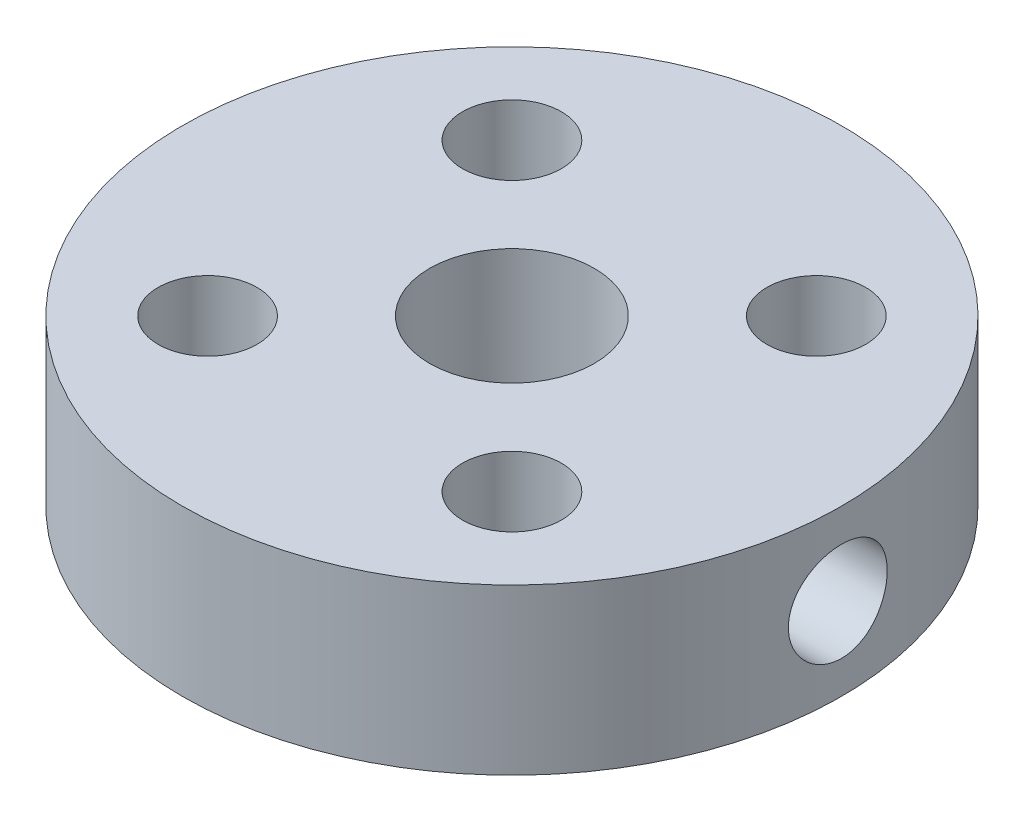
ISO-10303-21;
HEADER;
FILE_DESCRIPTION(('STEP AP214'),'2;1');
FILE_NAME('part.step','',(''),(''),'','','');
FILE_SCHEMA(('AUTOMOTIVE_DESIGN { 1 0 10303 214 1 1 1 1 }'));
ENDSEC;
DATA;
#1=APPLICATION_CONTEXT('core data for automotive mechanical design processes');
#2=APPLICATION_PROTOCOL_DEFINITION('international standard','automotive_design',2000,#1);
#3=PRODUCT_CONTEXT('',#1,'mechanical');
#4=PRODUCT('Part','Part','',(#3));
#5=PRODUCT_RELATED_PRODUCT_CATEGORY('part','',(#4));
#6=PRODUCT_DEFINITION_FORMATION('','',#4);
#7=PRODUCT_DEFINITION_CONTEXT('part definition',#1,'design');
#8=PRODUCT_DEFINITION('design','',#6,#7);
#9=PRODUCT_DEFINITION_SHAPE('','',#8);
#10=(LENGTH_UNIT() NAMED_UNIT(*) SI_UNIT(.MILLI.,.METRE.));
#11=(NAMED_UNIT(*) PLANE_ANGLE_UNIT() SI_UNIT($,.RADIAN.));
#12=(NAMED_UNIT(*) SI_UNIT($,.STERADIAN.) SOLID_ANGLE_UNIT());
#13=UNCERTAINTY_MEASURE_WITH_UNIT(LENGTH_MEASURE(1.E-05),#10,'distance_accuracy_value','');
#14=(GEOMETRIC_REPRESENTATION_CONTEXT(3) GLOBAL_UNCERTAINTY_ASSIGNED_CONTEXT((#13)) GLOBAL_UNIT_ASSIGNED_CONTEXT((#10,
#11,#12)) REPRESENTATION_CONTEXT('',''));
#15=CARTESIAN_POINT('',(0.,0.,0.));
#16=DIRECTION('',(0.,0.,1.));
#17=DIRECTION('',(1.,0.,0.));
#18=AXIS2_PLACEMENT_3D('',#15,#16,#17);
#19=CARTESIAN_POINT('',(-4.61740728114789,5.,4.61740728114842));
#20=DIRECTION('',(0.,-1.,0.));
#21=DIRECTION('',(0.,0.,-1.));
#22=AXIS2_PLACEMENT_3D('',#19,#20,#21);
#23=CYLINDRICAL_SURFACE('',#22,1.50000000000019);
#24=CARTESIAN_POINT('',(-4.61740728114789,5.,4.61740728114842));
#25=DIRECTION('',(0.,1.,0.));
#26=DIRECTION('',(0.,0.,1.));
#27=AXIS2_PLACEMENT_3D('',#24,#25,#26);
#28=CIRCLE('',#27,1.50000000000019);
#29=CARTESIAN_POINT('',(-4.61740728114789,5.,6.11740728114861));
#30=VERTEX_POINT('',#29);
#31=EDGE_CURVE('E52',#30,#30,#28,.T.);
#32=ORIENTED_EDGE('',*,*,#31,.T.);
#33=EDGE_LOOP('',(#32));
#34=FACE_BOUND('',#33,.T.);
#35=CARTESIAN_POINT('',(-4.61740728114789,0.,4.61740728114842));
#36=DIRECTION('',(0.,1.,0.));
#37=DIRECTION('',(0.,0.,1.));
#38=AXIS2_PLACEMENT_3D('',#35,#36,#37);
#39=CIRCLE('',#38,1.50000000000019);
#40=CARTESIAN_POINT('',(-4.61740728114789,0.,6.11740728114861));
#41=VERTEX_POINT('',#40);
#42=EDGE_CURVE('E103',#41,#41,#39,.T.);
#43=ORIENTED_EDGE('',*,*,#42,.F.);
#44=EDGE_LOOP('',(#43));
#45=FACE_BOUND('',#44,.T.);
#46=ADVANCED_FACE('F35',(#34,#45),#23,.F.);
#47=CARTESIAN_POINT('',(-4.61740728114816,5.,-4.61740728114789));
#48=DIRECTION('',(0.,-1.,0.));
#49=DIRECTION('',(0.,0.,-1.));
#50=AXIS2_PLACEMENT_3D('',#47,#48,#49);
#51=CYLINDRICAL_SURFACE('',#50,1.50000000000028);
#52=CARTESIAN_POINT('',(-4.61740728114816,5.,-4.61740728114789));
#53=DIRECTION('',(0.,1.,0.));
#54=DIRECTION('',(0.,0.,1.));
#55=AXIS2_PLACEMENT_3D('',#52,#53,#54);
#56=CIRCLE('',#55,1.50000000000028);
#57=CARTESIAN_POINT('',(-4.61740728114816,5.,-3.11740728114761));
#58=VERTEX_POINT('',#57);
#59=EDGE_CURVE('E119',#58,#58,#56,.T.);
#60=ORIENTED_EDGE('',*,*,#59,.T.);
#61=EDGE_LOOP('',(#60));
#62=FACE_BOUND('',#61,.T.);
#63=CARTESIAN_POINT('',(-4.61740728114816,0.,-4.61740728114789));
#64=DIRECTION('',(0.,1.,0.));
#65=DIRECTION('',(0.,0.,1.));
#66=AXIS2_PLACEMENT_3D('',#63,#64,#65);
#67=CIRCLE('',#66,1.50000000000028);
#68=CARTESIAN_POINT('',(-4.61740728114816,0.,-3.11740728114761));
#69=VERTEX_POINT('',#68);
#70=EDGE_CURVE('E99',#69,#69,#67,.T.);
#71=ORIENTED_EDGE('',*,*,#70,.F.);
#72=EDGE_LOOP('',(#71));
#73=FACE_BOUND('',#72,.T.);
#74=ADVANCED_FACE('F81',(#62,#73),#51,.F.);
#75=CARTESIAN_POINT('',(4.61740728114815,5.,-4.61740728114816));
#76=DIRECTION('',(0.,-1.,0.));
#77=DIRECTION('',(0.,0.,-1.));
#78=AXIS2_PLACEMENT_3D('',#75,#76,#77);
#79=CYLINDRICAL_SURFACE('',#78,1.5);
#80=CARTESIAN_POINT('',(4.61740728114815,5.,-4.61740728114816));
#81=DIRECTION('',(0.,1.,0.));
#82=DIRECTION('',(0.,0.,1.));
#83=AXIS2_PLACEMENT_3D('',#80,#81,#82);
#84=CIRCLE('',#83,1.5);
#85=CARTESIAN_POINT('',(4.61740728114815,5.,-3.11740728114816));
#86=VERTEX_POINT('',#85);
#87=EDGE_CURVE('E94',#86,#86,#84,.T.);
#88=ORIENTED_EDGE('',*,*,#87,.T.);
#89=EDGE_LOOP('',(#88));
#90=FACE_BOUND('',#89,.T.);
#91=CARTESIAN_POINT('',(4.61740728114815,0.,-4.61740728114816));
#92=DIRECTION('',(0.,1.,0.));
#93=DIRECTION('',(0.,0.,1.));
#94=AXIS2_PLACEMENT_3D('',#91,#92,#93);
#95=CIRCLE('',#94,1.5);
#96=CARTESIAN_POINT('',(4.61740728114815,0.,-3.11740728114816));
#97=VERTEX_POINT('',#96);
#98=EDGE_CURVE('E97',#97,#97,#95,.T.);
#99=ORIENTED_EDGE('',*,*,#98,.F.);
#100=EDGE_LOOP('',(#99));
#101=FACE_BOUND('',#100,.T.);
#102=ADVANCED_FACE('F84',(#90,#101),#79,.F.);
#103=CARTESIAN_POINT('',(0.,5.,0.));
#104=DIRECTION('',(0.,-1.,0.));
#105=DIRECTION('',(0.,0.,-1.));
#106=AXIS2_PLACEMENT_3D('',#103,#104,#105);
#107=CYLINDRICAL_SURFACE('',#106,10.);
#108=CARTESIAN_POINT('',(9.8868599666426,2.5,-1.5));
#109=CARTESIAN_POINT('',(9.88686136668593,2.41625443071005,-1.49999654107284));
#110=CARTESIAN_POINT('',(9.88793551739101,2.33246024924929,-1.49296296388491));
#111=CARTESIAN_POINT('',(9.8921131480324,2.16721468511687,-1.46502196657001));
#112=CARTESIAN_POINT('',(9.8952186073143,2.08576566851999,-1.44410101402628));
#113=CARTESIAN_POINT('',(9.90309938986228,1.9276262445531,-1.38902526098084));
#114=CARTESIAN_POINT('',(9.90787343131536,1.85093223745784,-1.35488061681397));
#115=CARTESIAN_POINT('',(9.91855194113145,1.70437296922792,-1.27435063087792));
#116=CARTESIAN_POINT('',(9.92445625383668,1.6345067697857,-1.22796697429872));
#117=CARTESIAN_POINT('',(9.9367828924804,1.50301618324567,-1.12387902418559));
#118=CARTESIAN_POINT('',(9.94320862458058,1.44145438659326,-1.0660960558482));
#119=CARTESIAN_POINT('',(9.95582368169047,1.3288625143445,-0.941019605444376));
#120=CARTESIAN_POINT('',(9.96201299368615,1.27783301783301,-0.873725600786531));
#121=CARTESIAN_POINT('',(9.97349347428185,1.18752336830864,-0.731136358052747));
#122=CARTESIAN_POINT('',(9.97878018435569,1.14830084967754,-0.655804227365769));
#123=CARTESIAN_POINT('',(9.98782206746405,1.08308840119182,-0.499528850106976));
#124=CARTESIAN_POINT('',(9.99157732141945,1.05709777215711,-0.418585900270679));
#125=CARTESIAN_POINT('',(9.99710914797782,1.01927661146916,-0.254031123090571));
#126=CARTESIAN_POINT('',(9.99890035887344,1.00734127361284,-0.170443884389868));
#127=CARTESIAN_POINT('',(10.0003524476958,0.997644065175104,-0.00243520401948097));
#128=CARTESIAN_POINT('',(10.0000134440494,0.999881406680311,0.0819861910157443));
#129=CARTESIAN_POINT('',(9.99725499660796,1.01838333776243,0.248551718200518));
#130=CARTESIAN_POINT('',(9.99485227652479,1.03453517179148,0.330708691400005));
#131=CARTESIAN_POINT('',(9.98825500227851,1.08023060632258,0.491132829143135));
#132=CARTESIAN_POINT('',(9.98406040199739,1.10977455150144,0.56939989351348));
#133=CARTESIAN_POINT('',(9.97432193873206,1.18153099691709,0.720163780770315));
#134=CARTESIAN_POINT('',(9.96877303515638,1.22379096510874,0.792637672323595));
#135=CARTESIAN_POINT('',(9.95694438245421,1.31974519366999,0.929507907150176));
#136=CARTESIAN_POINT('',(9.95066458523184,1.37344020670687,0.993903718271733));
#137=CARTESIAN_POINT('',(9.93800158192627,1.49136844882659,1.11345448272264));
#138=CARTESIAN_POINT('',(9.93161796623257,1.55570012197011,1.16851232950946));
#139=CARTESIAN_POINT('',(9.91952704453523,1.69274107712373,1.26706599338813));
#140=CARTESIAN_POINT('',(9.91381974269649,1.76545041071992,1.31056173927999));
#141=CARTESIAN_POINT('',(9.90372775286856,1.91728396294064,1.38476964534605));
#142=CARTESIAN_POINT('',(9.89934409845291,1.99641313366239,1.41547182270081));
#143=CARTESIAN_POINT('',(9.8924140289906,2.15878525514739,1.46312336208879));
#144=CARTESIAN_POINT('',(9.88986748446299,2.24202791554675,1.48007369337326));
#145=CARTESIAN_POINT('',(9.88692451395027,2.40940008957749,1.49960720086655));
#146=CARTESIAN_POINT('',(9.88650748802574,2.49351318820153,1.50232803265052));
#147=CARTESIAN_POINT('',(9.88781607937153,2.66099419481734,1.49369057019819));
#148=CARTESIAN_POINT('',(9.88954163015778,2.74436212585076,1.48233271282302));
#149=CARTESIAN_POINT('',(9.89492202461453,2.90755981796563,1.44597702952766));
#150=CARTESIAN_POINT('',(9.89856716482858,2.9874052049416,1.42104778527821));
#151=CARTESIAN_POINT('',(9.90736801825768,3.14178409204861,1.35832831947086));
#152=CARTESIAN_POINT('',(9.91252380607176,3.2163173296282,1.32053746276389));
#153=CARTESIAN_POINT('',(9.92381355687063,3.35857326033504,1.23283677995323));
#154=CARTESIAN_POINT('',(9.92995459279988,3.42624044727982,1.18283784561766));
#155=CARTESIAN_POINT('',(9.94250159433355,3.55227285987381,1.07226416837201));
#156=CARTESIAN_POINT('',(9.94890757490292,3.61063755918115,1.01168882744679));
#157=CARTESIAN_POINT('',(9.96132705217387,3.71690260663358,0.881075619628182));
#158=CARTESIAN_POINT('',(9.96733683460423,3.76471172824248,0.810963126771956));
#159=CARTESIAN_POINT('',(9.97822905032016,3.84787290526264,0.66362208026368));
#160=CARTESIAN_POINT('',(9.98311151444563,3.88322530146503,0.586393721360438));
#161=CARTESIAN_POINT('',(9.99118269660795,3.94032374248803,0.427297995861146));
#162=CARTESIAN_POINT('',(9.99437761717899,3.96211966707836,0.345448858754301));
#163=CARTESIAN_POINT('',(9.99873976656896,3.99164787953747,0.179200815501192));
#164=CARTESIAN_POINT('',(9.99990712930802,3.99938109624914,0.0948020781305798));
#165=CARTESIAN_POINT('',(10.0000812905914,4.0005417045494,-0.0732645908608196));
#166=CARTESIAN_POINT('',(9.99910917023796,3.99410868087698,-0.156931570212053));
#167=CARTESIAN_POINT('',(9.99515610519141,3.96741861157924,-0.321979795323108));
#168=CARTESIAN_POINT('',(9.99217516692666,3.94716161019144,-0.403361048396514));
#169=CARTESIAN_POINT('',(9.98453786742463,3.89344812442976,-0.561489374379662));
#170=CARTESIAN_POINT('',(9.97988273316947,3.86000130486107,-0.638239793148784));
#171=CARTESIAN_POINT('',(9.96940834495499,3.78087251201686,-0.785061117896604));
#172=CARTESIAN_POINT('',(9.96358905320338,3.73519014151966,-0.85513180692071));
#173=CARTESIAN_POINT('',(9.95136510636178,3.63238230117083,-0.987312585191961));
#174=CARTESIAN_POINT('',(9.94495548425942,3.57515377418366,-1.04934206644638));
#175=CARTESIAN_POINT('',(9.93231001689001,3.45109492691953,-1.16296808390268));
#176=CARTESIAN_POINT('',(9.92607421276291,3.38426235617565,-1.21456216798984));
#177=CARTESIAN_POINT('',(9.91444484029116,3.24245101676747,-1.30611310822974));
#178=CARTESIAN_POINT('',(9.90905620156986,3.16742858297817,-1.34600294291209));
#179=CARTESIAN_POINT('',(9.89978909110724,3.0117032232367,-1.41255613872045));
#180=CARTESIAN_POINT('',(9.89590905307931,2.93100629214218,-1.43923322574898));
#181=CARTESIAN_POINT('',(9.89099485524825,2.79162256374352,-1.47254951890026));
#182=CARTESIAN_POINT('',(9.8894524938238,2.73379660307573,-1.4828276978042));
#183=CARTESIAN_POINT('',(9.88738456567012,2.61732170826565,-1.49655410576574));
#184=CARTESIAN_POINT('',(9.88685898576156,2.55867278480039,-1.50000242335076));
#185=CARTESIAN_POINT('',(9.8868599666426,2.5,-1.5));
#186=B_SPLINE_CURVE_WITH_KNOTS('',3,(#108,#109,#110,#111,#112,#113,#114,#115,#116,#117,#118,
#119,#120,#121,#122,#123,#124,#125,#126,#127,#128,#129,#130,#131,#132,#133,#134,#135,#136,#137,
#138,#139,#140,#141,#142,#143,#144,#145,#146,#147,#148,#149,#150,#151,#152,#153,#154,#155,#156,
#157,#158,#159,#160,#161,#162,#163,#164,#165,#166,#167,#168,#169,#170,#171,#172,#173,#174,#175,
#176,#177,#178,#179,#180,#181,#182,#183,#184,#185),.UNSPECIFIED.,.T.,.F.,(4,2,2,2,2,2,2,2,2,2,2,
2,2,2,2,2,2,2,2,2,2,2,2,2,2,2,2,2,2,2,2,2,2,2,2,2,2,2,4),(0.,0.251022251804867,
0.502289469561802,0.753364085335674,1.00440414866132,1.25724158649107,1.51009292207817,
1.76415922105782,2.018212093645,2.27035832534397,2.52249053939374,2.77259862515728,
3.02271314839401,3.27377316386453,3.52484970949272,3.77839544666269,4.0319427451435,
4.28568751773138,4.53941440444341,4.79068214603743,5.04194209099918,5.29194394807374,
5.54195815286117,5.79385486001302,6.04576581461802,6.29977537753516,6.55377799071854,
6.8068404089109,7.05988611170473,7.31044963622326,7.56101235892823,7.81139182257833,
8.06177941567106,8.31450950010969,8.56729890236862,8.82150878824931,9.07545403445564,
9.25132441891613,9.42719252376192),.UNSPECIFIED.);
#187=CARTESIAN_POINT('',(9.8868599666426,2.5,-1.5));
#188=VERTEX_POINT('',#187);
#189=EDGE_CURVE('E10',#188,#188,#186,.T.);
#190=ORIENTED_EDGE('',*,*,#189,.T.);
#191=EDGE_LOOP('',(#190));
#192=FACE_BOUND('',#191,.T.);
#193=CARTESIAN_POINT('',(0.,5.,0.));
#194=DIRECTION('',(0.,1.,0.));
#195=DIRECTION('',(0.,0.,1.));
#196=AXIS2_PLACEMENT_3D('',#193,#194,#195);
#197=CIRCLE('',#196,10.);
#198=CARTESIAN_POINT('',(0.,5.,10.));
#199=VERTEX_POINT('',#198);
#200=EDGE_CURVE('E112',#199,#199,#197,.T.);
#201=ORIENTED_EDGE('',*,*,#200,.F.);
#202=EDGE_LOOP('',(#201));
#203=FACE_BOUND('',#202,.T.);
#204=CARTESIAN_POINT('',(0.,0.,0.));
#205=DIRECTION('',(0.,1.,0.));
#206=DIRECTION('',(0.,0.,1.));
#207=AXIS2_PLACEMENT_3D('',#204,#205,#206);
#208=CIRCLE('',#207,10.);
#209=CARTESIAN_POINT('',(0.,0.,10.));
#210=VERTEX_POINT('',#209);
#211=EDGE_CURVE('E100',#210,#210,#208,.T.);
#212=ORIENTED_EDGE('',*,*,#211,.T.);
#213=EDGE_LOOP('',(#212));
#214=FACE_BOUND('',#213,.T.);
#215=ADVANCED_FACE('F37',(#192,#203,#214),#107,.T.);
#216=CARTESIAN_POINT('',(4.61740728114842,5.,4.61740728114815));
#217=DIRECTION('',(0.,-1.,0.));
#218=DIRECTION('',(0.,0.,-1.));
#219=AXIS2_PLACEMENT_3D('',#216,#217,#218);
#220=CYLINDRICAL_SURFACE('',#219,1.49999999999994);
#221=CARTESIAN_POINT('',(4.61740728114842,5.,4.61740728114815));
#222=DIRECTION('',(0.,1.,0.));
#223=DIRECTION('',(0.,0.,1.));
#224=AXIS2_PLACEMENT_3D('',#221,#222,#223);
#225=CIRCLE('',#224,1.49999999999994);
#226=CARTESIAN_POINT('',(4.61740728114842,5.,6.11740728114809));
#227=VERTEX_POINT('',#226);
#228=EDGE_CURVE('E48',#227,#227,#225,.T.);
#229=ORIENTED_EDGE('',*,*,#228,.T.);
#230=EDGE_LOOP('',(#229));
#231=FACE_BOUND('',#230,.T.);
#232=CARTESIAN_POINT('',(4.61740728114842,0.,4.61740728114815));
#233=DIRECTION('',(0.,1.,0.));
#234=DIRECTION('',(0.,0.,1.));
#235=AXIS2_PLACEMENT_3D('',#232,#233,#234);
#236=CIRCLE('',#235,1.49999999999994);
#237=CARTESIAN_POINT('',(4.61740728114842,0.,6.11740728114809));
#238=VERTEX_POINT('',#237);
#239=EDGE_CURVE('E57',#238,#238,#236,.T.);
#240=ORIENTED_EDGE('',*,*,#239,.F.);
#241=EDGE_LOOP('',(#240));
#242=FACE_BOUND('',#241,.T.);
#243=ADVANCED_FACE('F71',(#231,#242),#220,.F.);
#244=CARTESIAN_POINT('',(0.,5.,0.));
#245=DIRECTION('',(0.,1.,0.));
#246=DIRECTION('',(0.,0.,1.));
#247=AXIS2_PLACEMENT_3D('',#244,#245,#246);
#248=PLANE('',#247);
#249=CARTESIAN_POINT('',(0.,5.,0.));
#250=DIRECTION('',(0.,1.,0.));
#251=DIRECTION('',(0.,0.,1.));
#252=AXIS2_PLACEMENT_3D('',#249,#250,#251);
#253=CIRCLE('',#252,2.5);
#254=CARTESIAN_POINT('',(0.,5.,2.5));
#255=VERTEX_POINT('',#254);
#256=EDGE_CURVE('E106',#255,#255,#253,.T.);
#257=ORIENTED_EDGE('',*,*,#256,.F.);
#258=EDGE_LOOP('',(#257));
#259=FACE_BOUND('',#258,.T.);
#260=ORIENTED_EDGE('',*,*,#200,.T.);
#261=EDGE_LOOP('',(#260));
#262=FACE_BOUND('',#261,.T.);
#263=ORIENTED_EDGE('',*,*,#87,.F.);
#264=EDGE_LOOP('',(#263));
#265=FACE_BOUND('',#264,.T.);
#266=ORIENTED_EDGE('',*,*,#59,.F.);
#267=EDGE_LOOP('',(#266));
#268=FACE_BOUND('',#267,.T.);
#269=ORIENTED_EDGE('',*,*,#31,.F.);
#270=EDGE_LOOP('',(#269));
#271=FACE_BOUND('',#270,.T.);
#272=ORIENTED_EDGE('',*,*,#228,.F.);
#273=EDGE_LOOP('',(#272));
#274=FACE_BOUND('',#273,.T.);
#275=ADVANCED_FACE('F67',(#259,#262,#265,#268,#271,#274),#248,.T.);
#276=CARTESIAN_POINT('',(0.,0.,0.));
#277=DIRECTION('',(0.,1.,0.));
#278=DIRECTION('',(0.,0.,1.));
#279=AXIS2_PLACEMENT_3D('',#276,#277,#278);
#280=PLANE('',#279);
#281=CARTESIAN_POINT('',(0.,0.,0.));
#282=DIRECTION('',(0.,-1.,0.));
#283=DIRECTION('',(0.,0.,-1.));
#284=AXIS2_PLACEMENT_3D('',#281,#282,#283);
#285=CIRCLE('',#284,2.5);
#286=CARTESIAN_POINT('',(0.,0.,-2.5));
#287=VERTEX_POINT('',#286);
#288=EDGE_CURVE('E139',#287,#287,#285,.T.);
#289=ORIENTED_EDGE('',*,*,#288,.F.);
#290=EDGE_LOOP('',(#289));
#291=FACE_BOUND('',#290,.T.);
#292=ORIENTED_EDGE('',*,*,#211,.F.);
#293=EDGE_LOOP('',(#292));
#294=FACE_BOUND('',#293,.T.);
#295=ORIENTED_EDGE('',*,*,#98,.T.);
#296=EDGE_LOOP('',(#295));
#297=FACE_BOUND('',#296,.T.);
#298=ORIENTED_EDGE('',*,*,#70,.T.);
#299=EDGE_LOOP('',(#298));
#300=FACE_BOUND('',#299,.T.);
#301=ORIENTED_EDGE('',*,*,#42,.T.);
#302=EDGE_LOOP('',(#301));
#303=FACE_BOUND('',#302,.T.);
#304=ORIENTED_EDGE('',*,*,#239,.T.);
#305=EDGE_LOOP('',(#304));
#306=FACE_BOUND('',#305,.T.);
#307=ADVANCED_FACE('F64',(#291,#294,#297,#300,#303,#306),#280,.F.);
#308=CARTESIAN_POINT('',(1.,2.5,0.));
#309=DIRECTION('',(1.,0.,0.));
#310=DIRECTION('',(0.,0.,-1.));
#311=AXIS2_PLACEMENT_3D('',#308,#309,#310);
#312=CYLINDRICAL_SURFACE('',#311,1.5);
#313=CARTESIAN_POINT('',(2.,2.5,-1.5));
#314=CARTESIAN_POINT('',(1.99999416642511,2.42452102471036,-1.50000404108592));
#315=CARTESIAN_POINT('',(2.00433633903481,2.3490615659202,-1.49426852824014));
#316=CARTESIAN_POINT('',(2.02092590613883,2.20067609603778,-1.47174965152787));
#317=CARTESIAN_POINT('',(2.03318155043097,2.1277528126149,-1.45495475788936));
#318=CARTESIAN_POINT('',(2.0636233903473,1.98691635832272,-1.41143486335796));
#319=CARTESIAN_POINT('',(2.08176666183119,1.91897116196473,-1.3847815450315));
#320=CARTESIAN_POINT('',(2.12185904995836,1.78856254663208,-1.3225290928302));
#321=CARTESIAN_POINT('',(2.14380930122416,1.72610077030486,-1.28692729054694));
#322=CARTESIAN_POINT('',(2.19228594587542,1.60005098333592,-1.20271292747644));
#323=CARTESIAN_POINT('',(2.21904371037662,1.53725904287606,-1.15304179435289));
#324=CARTESIAN_POINT('',(2.2722622943106,1.42023523725825,-1.04426801309985));
#325=CARTESIAN_POINT('',(2.29872287517103,1.3660098483292,-0.985158296729615));
#326=CARTESIAN_POINT('',(2.35175567858734,1.2618661902903,-0.851442367411704));
#327=CARTESIAN_POINT('',(2.37803133577818,1.21304553633025,-0.77585199516255));
#328=CARTESIAN_POINT('',(2.42443786983179,1.12919027755557,-0.615654228271661));
#329=CARTESIAN_POINT('',(2.44457437988735,1.09414302587729,-0.531055196626333));
#330=CARTESIAN_POINT('',(2.4747098780044,1.04240407718735,-0.363771406742668));
#331=CARTESIAN_POINT('',(2.4854930393917,1.0242796390327,-0.281674698130917));
#332=CARTESIAN_POINT('',(2.49874939277545,1.00205719713688,-0.11497050938271));
#333=CARTESIAN_POINT('',(2.50123038813308,0.997946021999946,-0.0303654624001554));
#334=CARTESIAN_POINT('',(2.49783372711539,1.00361374734246,0.127637283737308));
#335=CARTESIAN_POINT('',(2.49295437513726,1.01173352616931,0.201123832865632));
#336=CARTESIAN_POINT('',(2.47707997553857,1.03847979564811,0.345464269151766));
#337=CARTESIAN_POINT('',(2.46608447529309,1.05710706390716,0.4163179610512));
#338=CARTESIAN_POINT('',(2.43884907201719,1.10416556270378,0.554056780469078));
#339=CARTESIAN_POINT('',(2.42257910450824,1.132653061139,0.620916491037616));
#340=CARTESIAN_POINT('',(2.38609637638748,1.19838461622554,0.748988660115609));
#341=CARTESIAN_POINT('',(2.36588259201812,1.23563094705901,0.810199646208009));
#342=CARTESIAN_POINT('',(2.32037925976363,1.32283909280445,0.933074267143197));
#343=CARTESIAN_POINT('',(2.2947718295215,1.37378831173574,0.993918663198191));
#344=CARTESIAN_POINT('',(2.24255554245601,1.48440411786018,1.10671465909274));
#345=CARTESIAN_POINT('',(2.21594536703375,1.54408250347451,1.15865401308339));
#346=CARTESIAN_POINT('',(2.16111075123946,1.67865340616355,1.25824837767417));
#347=CARTESIAN_POINT('',(2.13305661385124,1.75450757653946,1.30470933188632));
#348=CARTESIAN_POINT('',(2.08250879557267,1.91470623163661,1.38397217194232));
#349=CARTESIAN_POINT('',(2.06000490298821,1.99903471612564,1.41679921962189));
#350=CARTESIAN_POINT('',(2.02895865196731,2.15239363189535,1.46077497064842));
#351=CARTESIAN_POINT('',(2.01833888618316,2.22004063229664,1.47527903312665));
#352=CARTESIAN_POINT('',(2.00392150777558,2.35737361029948,1.49480872755284));
#353=CARTESIAN_POINT('',(2.00011596115116,2.42705712048456,1.49984538302907));
#354=CARTESIAN_POINT('',(1.99988914321323,2.56655168243571,1.50014781114183));
#355=CARTESIAN_POINT('',(2.00347810223984,2.63636277721521,1.49540004697659));
#356=CARTESIAN_POINT('',(2.01751520788652,2.77398734374856,1.47640290574941));
#357=CARTESIAN_POINT('',(2.02796877613213,2.84179919224025,1.46214601830139));
#358=CARTESIAN_POINT('',(2.05431768333101,2.97371457947979,1.42488312618657));
#359=CARTESIAN_POINT('',(2.07020622092812,3.03782263653223,1.40188805257362));
#360=CARTESIAN_POINT('',(2.10571539417587,3.16147771573018,1.34796261057072));
#361=CARTESIAN_POINT('',(2.12533743689999,3.221023006366,1.31702924888212));
#362=CARTESIAN_POINT('',(2.17036819177737,3.34524008251225,1.24167439558512));
#363=CARTESIAN_POINT('',(2.19618239397369,3.40890083509657,1.19582663060302));
#364=CARTESIAN_POINT('',(2.24821754803621,3.52828548484946,1.09487395518701));
#365=CARTESIAN_POINT('',(2.27443886711455,3.58400169216912,1.03976018672402));
#366=CARTESIAN_POINT('',(2.32835625910913,3.69322400735043,0.913274837212765));
#367=CARTESIAN_POINT('',(2.3558007587587,3.74550072660584,0.84072110878019));
#368=CARTESIAN_POINT('',(2.40537639133459,3.83690277683665,0.686103100868018));
#369=CARTESIAN_POINT('',(2.42751104449411,3.87603682784092,0.604045176134701));
#370=CARTESIAN_POINT('',(2.46252280092775,3.93686820343137,0.438840232972136));
#371=CARTESIAN_POINT('',(2.47595588067329,3.95962622779111,0.356205963651257));
#372=CARTESIAN_POINT('',(2.494407389061,3.99071460284626,0.187383063890856));
#373=CARTESIAN_POINT('',(2.49943534582737,3.99906129071762,0.101198571781967));
#374=CARTESIAN_POINT('',(2.50040600461976,4.00067460858593,-0.0598120232009852));
#375=CARTESIAN_POINT('',(2.49747057186327,3.99580333456303,-0.134620583589707));
#376=CARTESIAN_POINT('',(2.48512948412095,3.97510617561839,-0.282148755978775));
#377=CARTESIAN_POINT('',(2.47572375706639,3.9592801686784,-0.354868344701915));
#378=CARTESIAN_POINT('',(2.45149427526962,3.91778042841621,-0.495145481978798));
#379=CARTESIAN_POINT('',(2.43675966858906,3.89226840387076,-0.562767032608831));
#380=CARTESIAN_POINT('',(2.40303337447155,3.83235940544525,-0.692781971999985));
#381=CARTESIAN_POINT('',(2.38404073252268,3.7979604391404,-0.755174184199833));
#382=CARTESIAN_POINT('',(2.3409343265938,3.71707480343124,-0.880263645295949));
#383=CARTESIAN_POINT('',(2.31648844639149,3.66968129098313,-0.942258690439941));
#384=CARTESIAN_POINT('',(2.26601907350661,3.56624696628228,-1.05789751536307));
#385=CARTESIAN_POINT('',(2.23999385274509,3.51019657439209,-1.11153190956916));
#386=CARTESIAN_POINT('',(2.18528165666204,3.3827144378223,-1.2159097535057));
#387=CARTESIAN_POINT('',(2.15667566270901,3.3102335138345,-1.26542406663368));
#388=CARTESIAN_POINT('',(2.10376464485145,3.15651514723346,-1.35156817210325));
#389=CARTESIAN_POINT('',(2.07945738811052,3.07528228601859,-1.38820466322661));
#390=CARTESIAN_POINT('',(2.0408000304796,2.9129357148628,-1.44437116535132));
#391=CARTESIAN_POINT('',(2.02577665830138,2.83240476403875,-1.46509526060188));
#392=CARTESIAN_POINT('',(2.00539032320036,2.66790260529632,-1.49289268240427));
#393=CARTESIAN_POINT('',(2.00000648744643,2.58393923424129,-1.49999550595837));
#394=CARTESIAN_POINT('',(2.,2.5,-1.5));
#395=B_SPLINE_CURVE_WITH_KNOTS('',3,(#313,#314,#315,#316,#317,#318,#319,#320,#321,#322,#323,
#324,#325,#326,#327,#328,#329,#330,#331,#332,#333,#334,#335,#336,#337,#338,#339,#340,#341,#342,
#343,#344,#345,#346,#347,#348,#349,#350,#351,#352,#353,#354,#355,#356,#357,#358,#359,#360,#361,
#362,#363,#364,#365,#366,#367,#368,#369,#370,#371,#372,#373,#374,#375,#376,#377,#378,#379,#380,
#381,#382,#383,#384,#385,#386,#387,#388,#389,#390,#391,#392,#393,#394),.UNSPECIFIED.,.T.,.F.,(4,
2,2,2,2,2,2,2,2,2,2,2,2,2,2,2,2,2,2,2,2,2,2,2,2,2,2,2,2,2,2,2,2,2,2,2,2,2,2,2,4),(0.,
0.226085249493392,0.45240657433077,0.677113624991875,0.901887762215932,1.15414462390001,
1.40659128601844,1.68630157736223,1.9657544327122,2.21853330858497,2.47107452602766,
2.69230130543181,2.91354445887944,3.13607155036376,3.35865648368878,3.60782810055849,
3.85733966656908,4.13576671140276,4.41367760154768,4.62276298054684,4.83160475643976,
5.04073566011181,5.25003193304128,5.45906724365495,5.6681814915466,5.91499438482002,
6.16204457978454,6.44121828011588,6.72020638384847,6.97891479383337,7.23732973022726,
7.46129321849399,7.68525920139648,7.90563970188756,8.12606965394584,8.37042963549487,
8.61506198741954,8.89071695766604,9.16622832484805,9.41820120134354,9.66962780912277),.UNSPECIFIED.);
#396=CARTESIAN_POINT('',(2.,2.5,-1.5));
#397=VERTEX_POINT('',#396);
#398=EDGE_CURVE('E40',#397,#397,#395,.T.);
#399=ORIENTED_EDGE('',*,*,#398,.T.);
#400=EDGE_LOOP('',(#399));
#401=FACE_BOUND('',#400,.T.);
#402=ORIENTED_EDGE('',*,*,#189,.F.);
#403=EDGE_LOOP('',(#402));
#404=FACE_BOUND('',#403,.T.);
#405=ADVANCED_FACE('F59',(#401,#404),#312,.F.);
#406=CARTESIAN_POINT('',(0.,10.,0.));
#407=DIRECTION('',(0.,-1.,0.));
#408=DIRECTION('',(0.,0.,-1.));
#409=AXIS2_PLACEMENT_3D('',#406,#407,#408);
#410=CYLINDRICAL_SURFACE('',#409,2.5);
#411=ORIENTED_EDGE('',*,*,#256,.T.);
#412=EDGE_LOOP('',(#411));
#413=FACE_BOUND('',#412,.T.);
#414=ORIENTED_EDGE('',*,*,#288,.T.);
#415=EDGE_LOOP('',(#414));
#416=FACE_BOUND('',#415,.T.);
#417=ORIENTED_EDGE('',*,*,#398,.F.);
#418=EDGE_LOOP('',(#417));
#419=FACE_BOUND('',#418,.T.);
#420=ADVANCED_FACE('F63',(#413,#416,#419),#410,.F.);
#421=CLOSED_SHELL('',(#46,#74,#102,#215,#243,#275,#307,#405,#420));
#422=MANIFOLD_SOLID_BREP('B2',#421);
#423=ADVANCED_BREP_SHAPE_REPRESENTATION('',(#18,#422),#14);
#424=SHAPE_DEFINITION_REPRESENTATION(#9,#423);
ENDSEC;
END-ISO-10303-21;
